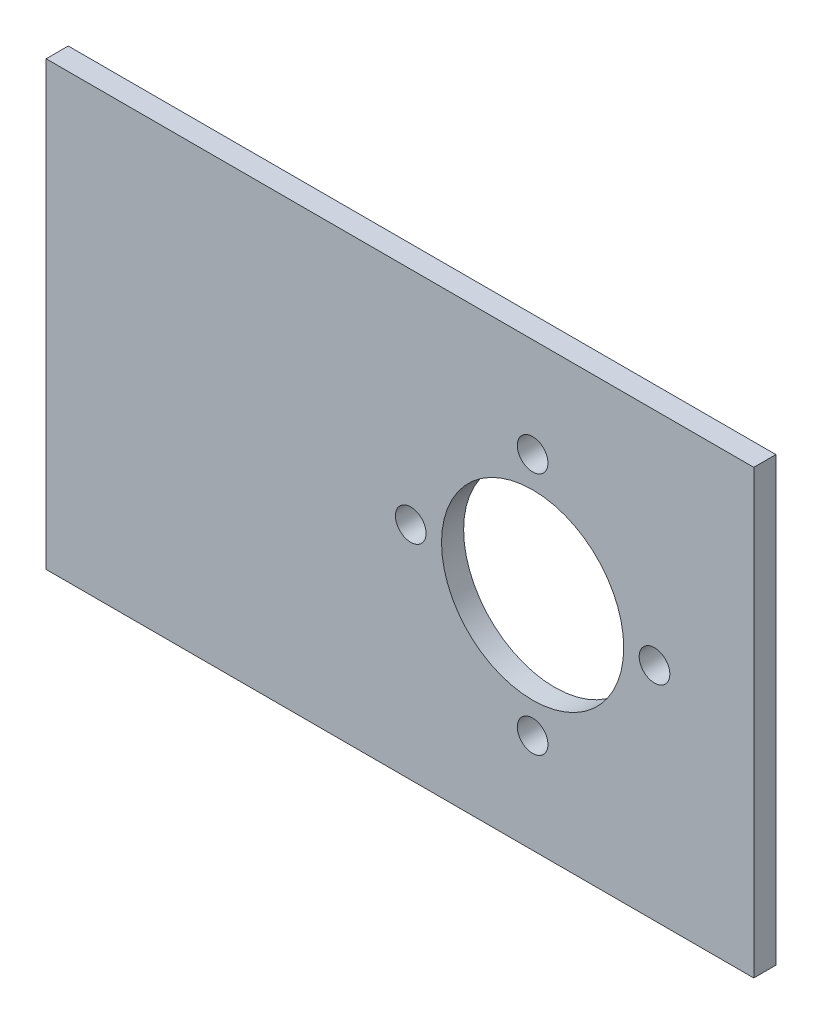
ISO-10303-21;
HEADER;
FILE_DESCRIPTION(('STEP AP214'),'2;1');
FILE_NAME('part.step','',(''),(''),'','','');
FILE_SCHEMA(('AUTOMOTIVE_DESIGN { 1 0 10303 214 1 1 1 1 }'));
ENDSEC;
DATA;
#1=APPLICATION_CONTEXT('core data for automotive mechanical design processes');
#2=APPLICATION_PROTOCOL_DEFINITION('international standard','automotive_design',2000,#1);
#3=PRODUCT_CONTEXT('',#1,'mechanical');
#4=PRODUCT('Part','Part','',(#3));
#5=PRODUCT_RELATED_PRODUCT_CATEGORY('part','',(#4));
#6=PRODUCT_DEFINITION_FORMATION('','',#4);
#7=PRODUCT_DEFINITION_CONTEXT('part definition',#1,'design');
#8=PRODUCT_DEFINITION('design','',#6,#7);
#9=PRODUCT_DEFINITION_SHAPE('','',#8);
#10=(LENGTH_UNIT() NAMED_UNIT(*) SI_UNIT(.MILLI.,.METRE.));
#11=(NAMED_UNIT(*) PLANE_ANGLE_UNIT() SI_UNIT($,.RADIAN.));
#12=(NAMED_UNIT(*) SI_UNIT($,.STERADIAN.) SOLID_ANGLE_UNIT());
#13=UNCERTAINTY_MEASURE_WITH_UNIT(LENGTH_MEASURE(1.E-05),#10,'distance_accuracy_value','');
#14=(GEOMETRIC_REPRESENTATION_CONTEXT(3) GLOBAL_UNCERTAINTY_ASSIGNED_CONTEXT((#13)) GLOBAL_UNIT_ASSIGNED_CONTEXT((#10,
#11,#12)) REPRESENTATION_CONTEXT('',''));
#15=CARTESIAN_POINT('',(0.,0.,0.));
#16=DIRECTION('',(0.,0.,1.));
#17=DIRECTION('',(1.,0.,0.));
#18=AXIS2_PLACEMENT_3D('',#15,#16,#17);
#19=CARTESIAN_POINT('',(31.75,0.,3.175));
#20=DIRECTION('',(1.,0.,0.));
#21=DIRECTION('',(0.,1.,0.));
#22=AXIS2_PLACEMENT_3D('',#19,#20,#21);
#23=PLANE('',#22);
#24=DIRECTION('',(0.,-1.,0.));
#25=VECTOR('',#24,1.);
#26=CARTESIAN_POINT('',(31.75,0.,0.));
#27=LINE('',#26,#25);
#28=CARTESIAN_POINT('',(31.75,31.75,0.));
#29=VERTEX_POINT('',#28);
#30=CARTESIAN_POINT('',(31.75,-31.75,0.));
#31=VERTEX_POINT('',#30);
#32=EDGE_CURVE('E121',#29,#31,#27,.T.);
#33=ORIENTED_EDGE('',*,*,#32,.F.);
#34=DIRECTION('',(0.,0.,-1.));
#35=VECTOR('',#34,1.);
#36=CARTESIAN_POINT('',(31.75,31.75,3.175));
#37=LINE('',#36,#35);
#38=CARTESIAN_POINT('',(31.75,31.75,3.175));
#39=VERTEX_POINT('',#38);
#40=EDGE_CURVE('E11',#39,#29,#37,.T.);
#41=ORIENTED_EDGE('',*,*,#40,.F.);
#42=DIRECTION('',(0.,-1.,0.));
#43=VECTOR('',#42,1.);
#44=CARTESIAN_POINT('',(31.75,0.,3.175));
#45=LINE('',#44,#43);
#46=CARTESIAN_POINT('',(31.75,-31.75,3.175));
#47=VERTEX_POINT('',#46);
#48=EDGE_CURVE('E99',#39,#47,#45,.T.);
#49=ORIENTED_EDGE('',*,*,#48,.T.);
#50=DIRECTION('',(0.,0.,-1.));
#51=VECTOR('',#50,1.);
#52=CARTESIAN_POINT('',(31.75,-31.75,3.175));
#53=LINE('',#52,#51);
#54=EDGE_CURVE('E77',#47,#31,#53,.T.);
#55=ORIENTED_EDGE('',*,*,#54,.T.);
#56=EDGE_LOOP('',(#33,#41,#49,#55));
#57=FACE_BOUND('',#56,.T.);
#58=ADVANCED_FACE('F37',(#57),#23,.T.);
#59=CARTESIAN_POINT('',(0.,31.75,3.175));
#60=DIRECTION('',(0.,1.,0.));
#61=DIRECTION('',(0.,0.,1.));
#62=AXIS2_PLACEMENT_3D('',#59,#60,#61);
#63=PLANE('',#62);
#64=DIRECTION('',(1.,0.,0.));
#65=VECTOR('',#64,1.);
#66=CARTESIAN_POINT('',(0.,31.75,0.));
#67=LINE('',#66,#65);
#68=CARTESIAN_POINT('',(-69.85,31.75,0.));
#69=VERTEX_POINT('',#68);
#70=EDGE_CURVE('E89',#69,#29,#67,.T.);
#71=ORIENTED_EDGE('',*,*,#70,.F.);
#72=DIRECTION('',(0.,0.,-1.));
#73=VECTOR('',#72,1.);
#74=CARTESIAN_POINT('',(-69.85,31.75,3.175));
#75=LINE('',#74,#73);
#76=CARTESIAN_POINT('',(-69.85,31.75,3.175));
#77=VERTEX_POINT('',#76);
#78=EDGE_CURVE('E46',#77,#69,#75,.T.);
#79=ORIENTED_EDGE('',*,*,#78,.F.);
#80=DIRECTION('',(1.,0.,0.));
#81=VECTOR('',#80,1.);
#82=CARTESIAN_POINT('',(0.,31.75,3.175));
#83=LINE('',#82,#81);
#84=EDGE_CURVE('E87',#77,#39,#83,.T.);
#85=ORIENTED_EDGE('',*,*,#84,.T.);
#86=ORIENTED_EDGE('',*,*,#40,.T.);
#87=EDGE_LOOP('',(#71,#79,#85,#86));
#88=FACE_BOUND('',#87,.T.);
#89=ADVANCED_FACE('F85',(#88),#63,.T.);
#90=CARTESIAN_POINT('',(-69.85,0.,3.175));
#91=DIRECTION('',(1.,0.,0.));
#92=DIRECTION('',(0.,1.,0.));
#93=AXIS2_PLACEMENT_3D('',#90,#91,#92);
#94=PLANE('',#93);
#95=DIRECTION('',(0.,-1.,0.));
#96=VECTOR('',#95,1.);
#97=CARTESIAN_POINT('',(-69.85,0.,0.));
#98=LINE('',#97,#96);
#99=CARTESIAN_POINT('',(-69.85,-31.75,0.));
#100=VERTEX_POINT('',#99);
#101=EDGE_CURVE('E124',#69,#100,#98,.T.);
#102=ORIENTED_EDGE('',*,*,#101,.T.);
#103=DIRECTION('',(0.,0.,-1.));
#104=VECTOR('',#103,1.);
#105=CARTESIAN_POINT('',(-69.85,-31.75,3.175));
#106=LINE('',#105,#104);
#107=CARTESIAN_POINT('',(-69.85,-31.75,3.175));
#108=VERTEX_POINT('',#107);
#109=EDGE_CURVE('E92',#108,#100,#106,.T.);
#110=ORIENTED_EDGE('',*,*,#109,.F.);
#111=DIRECTION('',(0.,-1.,0.));
#112=VECTOR('',#111,1.);
#113=CARTESIAN_POINT('',(-69.85,0.,3.175));
#114=LINE('',#113,#112);
#115=EDGE_CURVE('E94',#77,#108,#114,.T.);
#116=ORIENTED_EDGE('',*,*,#115,.F.);
#117=ORIENTED_EDGE('',*,*,#78,.T.);
#118=EDGE_LOOP('',(#102,#110,#116,#117));
#119=FACE_BOUND('',#118,.T.);
#120=ADVANCED_FACE('F95',(#119),#94,.F.);
#121=CARTESIAN_POINT('',(0.,-31.75,3.175));
#122=DIRECTION('',(0.,1.,0.));
#123=DIRECTION('',(0.,0.,1.));
#124=AXIS2_PLACEMENT_3D('',#121,#122,#123);
#125=PLANE('',#124);
#126=DIRECTION('',(1.,0.,0.));
#127=VECTOR('',#126,1.);
#128=CARTESIAN_POINT('',(0.,-31.75,0.));
#129=LINE('',#128,#127);
#130=EDGE_CURVE('E70',#100,#31,#129,.T.);
#131=ORIENTED_EDGE('',*,*,#130,.T.);
#132=ORIENTED_EDGE('',*,*,#54,.F.);
#133=DIRECTION('',(1.,0.,0.));
#134=VECTOR('',#133,1.);
#135=CARTESIAN_POINT('',(0.,-31.75,3.175));
#136=LINE('',#135,#134);
#137=EDGE_CURVE('E54',#108,#47,#136,.T.);
#138=ORIENTED_EDGE('',*,*,#137,.F.);
#139=ORIENTED_EDGE('',*,*,#109,.T.);
#140=EDGE_LOOP('',(#131,#132,#138,#139));
#141=FACE_BOUND('',#140,.T.);
#142=ADVANCED_FACE('F133',(#141),#125,.F.);
#143=CARTESIAN_POINT('',(0.,17.5006,3.175));
#144=DIRECTION('',(0.,0.,-1.));
#145=DIRECTION('',(-1.,0.,0.));
#146=AXIS2_PLACEMENT_3D('',#143,#144,#145);
#147=CYLINDRICAL_SURFACE('',#146,2.2);
#148=CARTESIAN_POINT('',(0.,17.5006,3.175));
#149=DIRECTION('',(0.,0.,1.));
#150=DIRECTION('',(1.,0.,0.));
#151=AXIS2_PLACEMENT_3D('',#148,#149,#150);
#152=CIRCLE('',#151,2.2);
#153=CARTESIAN_POINT('',(2.2,17.5006,3.175));
#154=VERTEX_POINT('',#153);
#155=EDGE_CURVE('E101',#154,#154,#152,.T.);
#156=ORIENTED_EDGE('',*,*,#155,.T.);
#157=EDGE_LOOP('',(#156));
#158=FACE_BOUND('',#157,.T.);
#159=CARTESIAN_POINT('',(0.,17.5006,0.));
#160=DIRECTION('',(0.,0.,1.));
#161=DIRECTION('',(1.,0.,0.));
#162=AXIS2_PLACEMENT_3D('',#159,#160,#161);
#163=CIRCLE('',#162,2.2);
#164=CARTESIAN_POINT('',(2.2,17.5006,0.));
#165=VERTEX_POINT('',#164);
#166=EDGE_CURVE('E118',#165,#165,#163,.T.);
#167=ORIENTED_EDGE('',*,*,#166,.F.);
#168=EDGE_LOOP('',(#167));
#169=FACE_BOUND('',#168,.T.);
#170=ADVANCED_FACE('F144',(#158,#169),#147,.F.);
#171=CARTESIAN_POINT('',(-17.5005999999995,-4.98732999343332E-13,3.175));
#172=DIRECTION('',(0.,0.,-1.));
#173=DIRECTION('',(-1.,0.,0.));
#174=AXIS2_PLACEMENT_3D('',#171,#172,#173);
#175=CYLINDRICAL_SURFACE('',#174,2.2);
#176=CARTESIAN_POINT('',(-17.5005999999995,-4.98732999343332E-13,3.175));
#177=DIRECTION('',(0.,0.,1.));
#178=DIRECTION('',(1.,0.,0.));
#179=AXIS2_PLACEMENT_3D('',#176,#177,#178);
#180=CIRCLE('',#179,2.2);
#181=CARTESIAN_POINT('',(-15.3005999999995,-4.98732999343332E-13,3.175));
#182=VERTEX_POINT('',#181);
#183=EDGE_CURVE('E269',#182,#182,#180,.T.);
#184=ORIENTED_EDGE('',*,*,#183,.T.);
#185=EDGE_LOOP('',(#184));
#186=FACE_BOUND('',#185,.T.);
#187=CARTESIAN_POINT('',(-17.5005999999995,-4.98732999343332E-13,0.));
#188=DIRECTION('',(0.,0.,1.));
#189=DIRECTION('',(1.,0.,0.));
#190=AXIS2_PLACEMENT_3D('',#187,#188,#189);
#191=CIRCLE('',#190,2.2);
#192=CARTESIAN_POINT('',(-15.3005999999995,-4.98732999343332E-13,0.));
#193=VERTEX_POINT('',#192);
#194=EDGE_CURVE('E115',#193,#193,#191,.T.);
#195=ORIENTED_EDGE('',*,*,#194,.F.);
#196=EDGE_LOOP('',(#195));
#197=FACE_BOUND('',#196,.T.);
#198=ADVANCED_FACE('F147',(#186,#197),#175,.F.);
#199=CARTESIAN_POINT('',(9.92261828258734E-13,-17.5006,3.175));
#200=DIRECTION('',(0.,0.,-1.));
#201=DIRECTION('',(-1.,0.,0.));
#202=AXIS2_PLACEMENT_3D('',#199,#200,#201);
#203=CYLINDRICAL_SURFACE('',#202,2.2);
#204=CARTESIAN_POINT('',(9.92261828258734E-13,-17.5006,3.175));
#205=DIRECTION('',(0.,0.,1.));
#206=DIRECTION('',(1.,0.,0.));
#207=AXIS2_PLACEMENT_3D('',#204,#205,#206);
#208=CIRCLE('',#207,2.2);
#209=CARTESIAN_POINT('',(2.20000000000099,-17.5006,3.175));
#210=VERTEX_POINT('',#209);
#211=EDGE_CURVE('E162',#210,#210,#208,.T.);
#212=ORIENTED_EDGE('',*,*,#211,.T.);
#213=EDGE_LOOP('',(#212));
#214=FACE_BOUND('',#213,.T.);
#215=CARTESIAN_POINT('',(9.92261828258734E-13,-17.5006,0.));
#216=DIRECTION('',(0.,0.,1.));
#217=DIRECTION('',(1.,0.,0.));
#218=AXIS2_PLACEMENT_3D('',#215,#216,#217);
#219=CIRCLE('',#218,2.2);
#220=CARTESIAN_POINT('',(2.20000000000099,-17.5006,0.));
#221=VERTEX_POINT('',#220);
#222=EDGE_CURVE('E112',#221,#221,#219,.T.);
#223=ORIENTED_EDGE('',*,*,#222,.F.);
#224=EDGE_LOOP('',(#223));
#225=FACE_BOUND('',#224,.T.);
#226=ADVANCED_FACE('F150',(#214,#225),#203,.F.);
#227=CARTESIAN_POINT('',(17.5006000000005,4.96998275867355E-13,3.175));
#228=DIRECTION('',(0.,0.,-1.));
#229=DIRECTION('',(-1.,0.,0.));
#230=AXIS2_PLACEMENT_3D('',#227,#228,#229);
#231=CYLINDRICAL_SURFACE('',#230,2.2);
#232=CARTESIAN_POINT('',(17.5006000000005,4.96998275867355E-13,3.175));
#233=DIRECTION('',(0.,0.,1.));
#234=DIRECTION('',(1.,0.,0.));
#235=AXIS2_PLACEMENT_3D('',#232,#233,#234);
#236=CIRCLE('',#235,2.2);
#237=CARTESIAN_POINT('',(19.7006000000005,4.96998275867355E-13,3.175));
#238=VERTEX_POINT('',#237);
#239=EDGE_CURVE('E130',#238,#238,#236,.T.);
#240=ORIENTED_EDGE('',*,*,#239,.T.);
#241=EDGE_LOOP('',(#240));
#242=FACE_BOUND('',#241,.T.);
#243=CARTESIAN_POINT('',(17.5006000000005,4.96998275867355E-13,0.));
#244=DIRECTION('',(0.,0.,1.));
#245=DIRECTION('',(1.,0.,0.));
#246=AXIS2_PLACEMENT_3D('',#243,#244,#245);
#247=CIRCLE('',#246,2.2);
#248=CARTESIAN_POINT('',(19.7006000000005,4.96998275867355E-13,0.));
#249=VERTEX_POINT('',#248);
#250=EDGE_CURVE('E109',#249,#249,#247,.T.);
#251=ORIENTED_EDGE('',*,*,#250,.F.);
#252=EDGE_LOOP('',(#251));
#253=FACE_BOUND('',#252,.T.);
#254=ADVANCED_FACE('F39',(#242,#253),#231,.F.);
#255=CARTESIAN_POINT('',(0.,0.,3.175));
#256=DIRECTION('',(0.,0.,-1.));
#257=DIRECTION('',(-1.,0.,0.));
#258=AXIS2_PLACEMENT_3D('',#255,#256,#257);
#259=CYLINDRICAL_SURFACE('',#258,13.081);
#260=CARTESIAN_POINT('',(0.,0.,3.175));
#261=DIRECTION('',(0.,0.,1.));
#262=DIRECTION('',(1.,0.,0.));
#263=AXIS2_PLACEMENT_3D('',#260,#261,#262);
#264=CIRCLE('',#263,13.081);
#265=CARTESIAN_POINT('',(13.081,0.,3.175));
#266=VERTEX_POINT('',#265);
#267=EDGE_CURVE('E106',#266,#266,#264,.T.);
#268=ORIENTED_EDGE('',*,*,#267,.T.);
#269=EDGE_LOOP('',(#268));
#270=FACE_BOUND('',#269,.T.);
#271=CARTESIAN_POINT('',(0.,0.,0.));
#272=DIRECTION('',(0.,0.,1.));
#273=DIRECTION('',(1.,0.,0.));
#274=AXIS2_PLACEMENT_3D('',#271,#272,#273);
#275=CIRCLE('',#274,13.081);
#276=CARTESIAN_POINT('',(13.081,0.,0.));
#277=VERTEX_POINT('',#276);
#278=EDGE_CURVE('E127',#277,#277,#275,.T.);
#279=ORIENTED_EDGE('',*,*,#278,.F.);
#280=EDGE_LOOP('',(#279));
#281=FACE_BOUND('',#280,.T.);
#282=ADVANCED_FACE('F157',(#270,#281),#259,.F.);
#283=CARTESIAN_POINT('',(0.,0.,3.175));
#284=DIRECTION('',(0.,0.,1.));
#285=DIRECTION('',(1.,0.,0.));
#286=AXIS2_PLACEMENT_3D('',#283,#284,#285);
#287=PLANE('',#286);
#288=ORIENTED_EDGE('',*,*,#239,.F.);
#289=EDGE_LOOP('',(#288));
#290=FACE_BOUND('',#289,.T.);
#291=ORIENTED_EDGE('',*,*,#211,.F.);
#292=EDGE_LOOP('',(#291));
#293=FACE_BOUND('',#292,.T.);
#294=ORIENTED_EDGE('',*,*,#183,.F.);
#295=EDGE_LOOP('',(#294));
#296=FACE_BOUND('',#295,.T.);
#297=ORIENTED_EDGE('',*,*,#155,.F.);
#298=EDGE_LOOP('',(#297));
#299=FACE_BOUND('',#298,.T.);
#300=ORIENTED_EDGE('',*,*,#48,.F.);
#301=ORIENTED_EDGE('',*,*,#84,.F.);
#302=ORIENTED_EDGE('',*,*,#115,.T.);
#303=ORIENTED_EDGE('',*,*,#137,.T.);
#304=EDGE_LOOP('',(#300,#301,#302,#303));
#305=FACE_BOUND('',#304,.T.);
#306=ORIENTED_EDGE('',*,*,#267,.F.);
#307=EDGE_LOOP('',(#306));
#308=FACE_BOUND('',#307,.T.);
#309=ADVANCED_FACE('F97',(#290,#293,#296,#299,#305,#308),#287,.T.);
#310=CARTESIAN_POINT('',(0.,0.,0.));
#311=DIRECTION('',(0.,0.,1.));
#312=DIRECTION('',(1.,0.,0.));
#313=AXIS2_PLACEMENT_3D('',#310,#311,#312);
#314=PLANE('',#313);
#315=ORIENTED_EDGE('',*,*,#250,.T.);
#316=EDGE_LOOP('',(#315));
#317=FACE_BOUND('',#316,.T.);
#318=ORIENTED_EDGE('',*,*,#222,.T.);
#319=EDGE_LOOP('',(#318));
#320=FACE_BOUND('',#319,.T.);
#321=ORIENTED_EDGE('',*,*,#194,.T.);
#322=EDGE_LOOP('',(#321));
#323=FACE_BOUND('',#322,.T.);
#324=ORIENTED_EDGE('',*,*,#166,.T.);
#325=EDGE_LOOP('',(#324));
#326=FACE_BOUND('',#325,.T.);
#327=ORIENTED_EDGE('',*,*,#32,.T.);
#328=ORIENTED_EDGE('',*,*,#130,.F.);
#329=ORIENTED_EDGE('',*,*,#101,.F.);
#330=ORIENTED_EDGE('',*,*,#70,.T.);
#331=EDGE_LOOP('',(#327,#328,#329,#330));
#332=FACE_BOUND('',#331,.T.);
#333=ORIENTED_EDGE('',*,*,#278,.T.);
#334=EDGE_LOOP('',(#333));
#335=FACE_BOUND('',#334,.T.);
#336=ADVANCED_FACE('F134',(#317,#320,#323,#326,#332,#335),#314,.F.);
#337=CLOSED_SHELL('',(#58,#89,#120,#142,#170,#198,#226,#254,#282,#309,#336));
#338=MANIFOLD_SOLID_BREP('B2',#337);
#339=ADVANCED_BREP_SHAPE_REPRESENTATION('',(#18,#338),#14);
#340=SHAPE_DEFINITION_REPRESENTATION(#9,#339);
ENDSEC;
END-ISO-10303-21;
